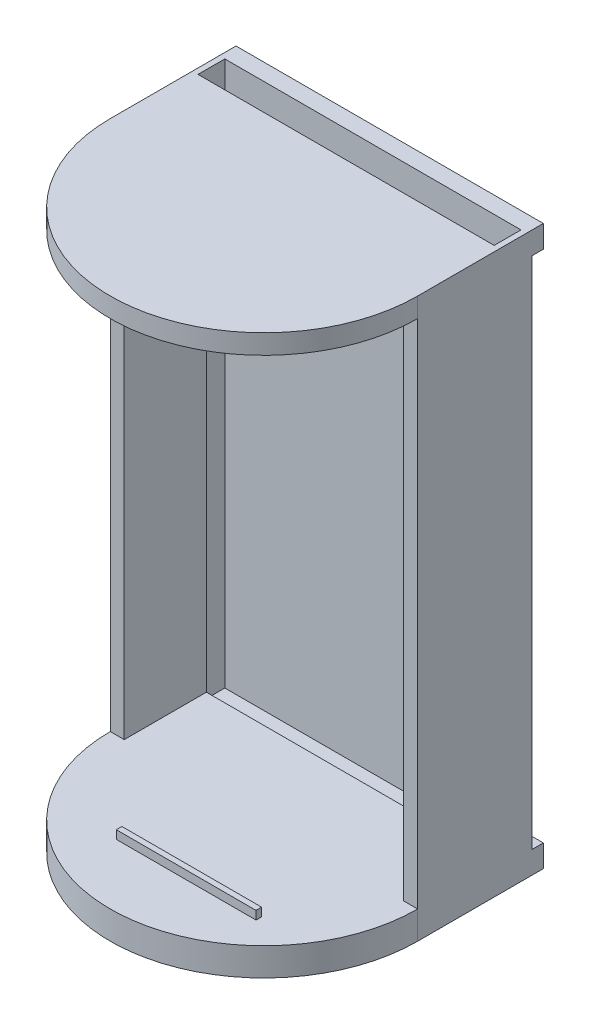
ISO-10303-21;
HEADER;
FILE_DESCRIPTION(('STEP AP214'),'2;1');
FILE_NAME('part.step','',(''),(''),'','','');
FILE_SCHEMA(('AUTOMOTIVE_DESIGN { 1 0 10303 214 1 1 1 1 }'));
ENDSEC;
DATA;
#1=APPLICATION_CONTEXT('core data for automotive mechanical design processes');
#2=APPLICATION_PROTOCOL_DEFINITION('international standard','automotive_design',2000,#1);
#3=PRODUCT_CONTEXT('',#1,'mechanical');
#4=PRODUCT('Part','Part','',(#3));
#5=PRODUCT_RELATED_PRODUCT_CATEGORY('part','',(#4));
#6=PRODUCT_DEFINITION_FORMATION('','',#4);
#7=PRODUCT_DEFINITION_CONTEXT('part definition',#1,'design');
#8=PRODUCT_DEFINITION('design','',#6,#7);
#9=PRODUCT_DEFINITION_SHAPE('','',#8);
#10=(LENGTH_UNIT() NAMED_UNIT(*) SI_UNIT(.MILLI.,.METRE.));
#11=(NAMED_UNIT(*) PLANE_ANGLE_UNIT() SI_UNIT($,.RADIAN.));
#12=(NAMED_UNIT(*) SI_UNIT($,.STERADIAN.) SOLID_ANGLE_UNIT());
#13=UNCERTAINTY_MEASURE_WITH_UNIT(LENGTH_MEASURE(1.E-05),#10,'distance_accuracy_value','');
#14=(GEOMETRIC_REPRESENTATION_CONTEXT(3) GLOBAL_UNCERTAINTY_ASSIGNED_CONTEXT((#13)) GLOBAL_UNIT_ASSIGNED_CONTEXT((#10,
#11,#12)) REPRESENTATION_CONTEXT('',''));
#15=CARTESIAN_POINT('',(0.,0.,0.));
#16=DIRECTION('',(0.,0.,1.));
#17=DIRECTION('',(1.,0.,0.));
#18=AXIS2_PLACEMENT_3D('',#15,#16,#17);
#19=CARTESIAN_POINT('',(2.69425675675678,75.5,45.));
#20=DIRECTION('',(0.,1.,0.));
#21=DIRECTION('',(0.,0.,1.));
#22=AXIS2_PLACEMENT_3D('',#19,#20,#21);
#23=PLANE('',#22);
#24=DIRECTION('',(0.,0.,-1.));
#25=VECTOR('',#24,1.);
#26=CARTESIAN_POINT('',(-47.3057432432433,75.5,45.));
#27=LINE('',#26,#25);
#28=CARTESIAN_POINT('',(-47.3057432432433,75.5,45.));
#29=VERTEX_POINT('',#28);
#30=CARTESIAN_POINT('',(-47.3057432432433,75.5,15.6));
#31=VERTEX_POINT('',#30);
#32=EDGE_CURVE('E329',#29,#31,#27,.T.);
#33=ORIENTED_EDGE('',*,*,#32,.T.);
#34=DIRECTION('',(1.,0.,0.));
#35=VECTOR('',#34,1.);
#36=CARTESIAN_POINT('',(2.69425675675677,75.5,15.6));
#37=LINE('',#36,#35);
#38=CARTESIAN_POINT('',(52.6942567567568,75.5,15.6));
#39=VERTEX_POINT('',#38);
#40=EDGE_CURVE('E251',#31,#39,#37,.T.);
#41=ORIENTED_EDGE('',*,*,#40,.T.);
#42=DIRECTION('',(0.,0.,1.));
#43=VECTOR('',#42,1.);
#44=CARTESIAN_POINT('',(52.6942567567568,75.5,45.));
#45=LINE('',#44,#43);
#46=CARTESIAN_POINT('',(52.6942567567568,75.5,45.));
#47=VERTEX_POINT('',#46);
#48=EDGE_CURVE('E325',#39,#47,#45,.T.);
#49=ORIENTED_EDGE('',*,*,#48,.T.);
#50=DIRECTION('',(-1.,0.,0.));
#51=VECTOR('',#50,1.);
#52=CARTESIAN_POINT('',(0.,75.5,45.));
#53=LINE('',#52,#51);
#54=CARTESIAN_POINT('',(57.6942567567567,75.5,45.));
#55=VERTEX_POINT('',#54);
#56=EDGE_CURVE('E362',#55,#47,#53,.T.);
#57=ORIENTED_EDGE('',*,*,#56,.F.);
#58=CARTESIAN_POINT('',(2.69425675675678,75.5,45.));
#59=DIRECTION('',(0.,1.,0.));
#60=DIRECTION('',(0.,0.,1.));
#61=AXIS2_PLACEMENT_3D('',#58,#59,#60);
#62=CIRCLE('',#61,55.);
#63=CARTESIAN_POINT('',(-52.3057432432433,75.5,45.));
#64=VERTEX_POINT('',#63);
#65=EDGE_CURVE('E317',#64,#55,#62,.T.);
#66=ORIENTED_EDGE('',*,*,#65,.F.);
#67=DIRECTION('',(-1.,0.,0.));
#68=VECTOR('',#67,1.);
#69=CARTESIAN_POINT('',(0.,75.5,45.));
#70=LINE('',#69,#68);
#71=EDGE_CURVE('E327',#29,#64,#70,.T.);
#72=ORIENTED_EDGE('',*,*,#71,.F.);
#73=EDGE_LOOP('',(#33,#41,#49,#57,#66,#72));
#74=FACE_BOUND('',#73,.T.);
#75=DIRECTION('',(0.,0.,1.));
#76=VECTOR('',#75,1.);
#77=CARTESIAN_POINT('',(29.5986502872779,75.5,77.3382333741336));
#78=LINE('',#77,#76);
#79=CARTESIAN_POINT('',(29.5986502872779,75.5,75.3382333741336));
#80=VERTEX_POINT('',#79);
#81=CARTESIAN_POINT('',(29.5986502872779,75.5,77.3382333741336));
#82=VERTEX_POINT('',#81);
#83=EDGE_CURVE('E257',#80,#82,#78,.T.);
#84=ORIENTED_EDGE('',*,*,#83,.F.);
#85=DIRECTION('',(1.,0.,0.));
#86=VECTOR('',#85,1.);
#87=CARTESIAN_POINT('',(-20.4013497127221,75.5,75.3382333741336));
#88=LINE('',#87,#86);
#89=CARTESIAN_POINT('',(-20.4013497127221,75.5,75.3382333741336));
#90=VERTEX_POINT('',#89);
#91=EDGE_CURVE('E262',#90,#80,#88,.T.);
#92=ORIENTED_EDGE('',*,*,#91,.F.);
#93=DIRECTION('',(0.,0.,-1.));
#94=VECTOR('',#93,1.);
#95=CARTESIAN_POINT('',(-20.4013497127221,75.5,77.3382333741336));
#96=LINE('',#95,#94);
#97=CARTESIAN_POINT('',(-20.4013497127221,75.5,77.3382333741336));
#98=VERTEX_POINT('',#97);
#99=EDGE_CURVE('E274',#98,#90,#96,.T.);
#100=ORIENTED_EDGE('',*,*,#99,.F.);
#101=DIRECTION('',(-1.,0.,0.));
#102=VECTOR('',#101,1.);
#103=CARTESIAN_POINT('',(-20.4013497127221,75.5,77.3382333741336));
#104=LINE('',#103,#102);
#105=EDGE_CURVE('E271',#82,#98,#104,.T.);
#106=ORIENTED_EDGE('',*,*,#105,.F.);
#107=EDGE_LOOP('',(#84,#92,#100,#106));
#108=FACE_BOUND('',#107,.T.);
#109=ADVANCED_FACE('F38',(#74,#108),#23,.F.);
#110=CARTESIAN_POINT('',(2.69425675675677,-107.5,45.));
#111=DIRECTION('',(0.,1.,0.));
#112=DIRECTION('',(0.,0.,1.));
#113=AXIS2_PLACEMENT_3D('',#110,#111,#112);
#114=PLANE('',#113);
#115=DIRECTION('',(1.,0.,0.));
#116=VECTOR('',#115,1.);
#117=CARTESIAN_POINT('',(2.69425675675677,-107.5,15.6));
#118=LINE('',#117,#116);
#119=CARTESIAN_POINT('',(-47.3057432432432,-107.5,15.6));
#120=VERTEX_POINT('',#119);
#121=CARTESIAN_POINT('',(52.6942567567568,-107.5,15.6));
#122=VERTEX_POINT('',#121);
#123=EDGE_CURVE('E53',#120,#122,#118,.T.);
#124=ORIENTED_EDGE('',*,*,#123,.F.);
#125=DIRECTION('',(0.,0.,1.));
#126=VECTOR('',#125,1.);
#127=CARTESIAN_POINT('',(-47.3057432432432,-107.5,45.));
#128=LINE('',#127,#126);
#129=CARTESIAN_POINT('',(-47.3057432432432,-107.5,45.));
#130=VERTEX_POINT('',#129);
#131=EDGE_CURVE('E373',#120,#130,#128,.T.);
#132=ORIENTED_EDGE('',*,*,#131,.T.);
#133=DIRECTION('',(1.,0.,0.));
#134=VECTOR('',#133,1.);
#135=CARTESIAN_POINT('',(2.69425675675677,-107.5,45.));
#136=LINE('',#135,#134);
#137=CARTESIAN_POINT('',(-52.3057432432432,-107.5,45.));
#138=VERTEX_POINT('',#137);
#139=EDGE_CURVE('E370',#138,#130,#136,.T.);
#140=ORIENTED_EDGE('',*,*,#139,.F.);
#141=CARTESIAN_POINT('',(2.69425675675677,-107.5,45.));
#142=DIRECTION('',(0.,-1.,0.));
#143=DIRECTION('',(0.,0.,1.));
#144=AXIS2_PLACEMENT_3D('',#141,#142,#143);
#145=CIRCLE('',#144,55.);
#146=CARTESIAN_POINT('',(57.6942567567568,-107.5,45.));
#147=VERTEX_POINT('',#146);
#148=EDGE_CURVE('E405',#147,#138,#145,.T.);
#149=ORIENTED_EDGE('',*,*,#148,.F.);
#150=DIRECTION('',(1.,0.,0.));
#151=VECTOR('',#150,1.);
#152=CARTESIAN_POINT('',(2.69425675675677,-107.5,45.));
#153=LINE('',#152,#151);
#154=CARTESIAN_POINT('',(52.6942567567568,-107.5,45.));
#155=VERTEX_POINT('',#154);
#156=EDGE_CURVE('E365',#155,#147,#153,.T.);
#157=ORIENTED_EDGE('',*,*,#156,.F.);
#158=DIRECTION('',(0.,0.,-1.));
#159=VECTOR('',#158,1.);
#160=CARTESIAN_POINT('',(52.6942567567568,-107.5,45.));
#161=LINE('',#160,#159);
#162=EDGE_CURVE('E367',#155,#122,#161,.T.);
#163=ORIENTED_EDGE('',*,*,#162,.T.);
#164=EDGE_LOOP('',(#124,#132,#140,#149,#157,#163));
#165=FACE_BOUND('',#164,.T.);
#166=DIRECTION('',(-1.,0.,0.));
#167=VECTOR('',#166,1.);
#168=CARTESIAN_POINT('',(-17.8057432432433,-107.5,75.3382333741336));
#169=LINE('',#168,#167);
#170=CARTESIAN_POINT('',(32.1942567567567,-107.5,75.3382333741336));
#171=VERTEX_POINT('',#170);
#172=CARTESIAN_POINT('',(-17.8057432432433,-107.5,75.3382333741336));
#173=VERTEX_POINT('',#172);
#174=EDGE_CURVE('E389',#171,#173,#169,.T.);
#175=ORIENTED_EDGE('',*,*,#174,.F.);
#176=DIRECTION('',(0.,0.,-1.));
#177=VECTOR('',#176,1.);
#178=CARTESIAN_POINT('',(32.1942567567567,-107.5,75.3382333741336));
#179=LINE('',#178,#177);
#180=CARTESIAN_POINT('',(32.1942567567567,-107.5,77.3382333741336));
#181=VERTEX_POINT('',#180);
#182=EDGE_CURVE('E375',#181,#171,#179,.T.);
#183=ORIENTED_EDGE('',*,*,#182,.F.);
#184=DIRECTION('',(1.,0.,0.));
#185=VECTOR('',#184,1.);
#186=CARTESIAN_POINT('',(-17.8057432432433,-107.5,77.3382333741336));
#187=LINE('',#186,#185);
#188=CARTESIAN_POINT('',(-17.8057432432433,-107.5,77.3382333741336));
#189=VERTEX_POINT('',#188);
#190=EDGE_CURVE('E380',#189,#181,#187,.T.);
#191=ORIENTED_EDGE('',*,*,#190,.F.);
#192=DIRECTION('',(0.,0.,1.));
#193=VECTOR('',#192,1.);
#194=CARTESIAN_POINT('',(-17.8057432432433,-107.5,75.3382333741336));
#195=LINE('',#194,#193);
#196=EDGE_CURVE('E391',#173,#189,#195,.T.);
#197=ORIENTED_EDGE('',*,*,#196,.F.);
#198=EDGE_LOOP('',(#175,#183,#191,#197));
#199=FACE_BOUND('',#198,.T.);
#200=ADVANCED_FACE('F457',(#165,#199),#114,.T.);
#201=CARTESIAN_POINT('',(-52.3057432432432,-107.5,15.));
#202=DIRECTION('',(-1.,0.,0.));
#203=DIRECTION('',(0.,0.,1.));
#204=AXIS2_PLACEMENT_3D('',#201,#202,#203);
#205=PLANE('',#204);
#206=DIRECTION('',(0.,0.,-1.));
#207=VECTOR('',#206,1.);
#208=CARTESIAN_POINT('',(-52.3057432432432,-117.5,15.));
#209=LINE('',#208,#207);
#210=CARTESIAN_POINT('',(-52.3057432432432,-117.5,45.));
#211=VERTEX_POINT('',#210);
#212=CARTESIAN_POINT('',(-52.3057432432433,-117.5,0.));
#213=VERTEX_POINT('',#212);
#214=EDGE_CURVE('E408',#211,#213,#209,.T.);
#215=ORIENTED_EDGE('',*,*,#214,.F.);
#216=DIRECTION('',(0.,-1.,0.));
#217=VECTOR('',#216,1.);
#218=CARTESIAN_POINT('',(-52.3057432432432,-107.5,45.));
#219=LINE('',#218,#217);
#220=EDGE_CURVE('E11',#138,#211,#219,.T.);
#221=ORIENTED_EDGE('',*,*,#220,.F.);
#222=DIRECTION('',(0.,-1.,0.));
#223=VECTOR('',#222,1.);
#224=CARTESIAN_POINT('',(-52.3057432432433,82.5,45.));
#225=LINE('',#224,#223);
#226=EDGE_CURVE('E337',#64,#138,#225,.T.);
#227=ORIENTED_EDGE('',*,*,#226,.F.);
#228=CARTESIAN_POINT('',(-52.3057432432433,82.5,45.));
#229=VERTEX_POINT('',#228);
#230=EDGE_CURVE('E338',#229,#64,#225,.T.);
#231=ORIENTED_EDGE('',*,*,#230,.F.);
#232=DIRECTION('',(0.,0.,-1.));
#233=VECTOR('',#232,1.);
#234=CARTESIAN_POINT('',(-52.3057432432433,82.5,15.));
#235=LINE('',#234,#233);
#236=CARTESIAN_POINT('',(-52.3057432432433,82.5,0.));
#237=VERTEX_POINT('',#236);
#238=EDGE_CURVE('E357',#229,#237,#235,.T.);
#239=ORIENTED_EDGE('',*,*,#238,.T.);
#240=DIRECTION('',(0.,-1.,0.));
#241=VECTOR('',#240,1.);
#242=CARTESIAN_POINT('',(-52.3057432432433,-117.5,0.));
#243=LINE('',#242,#241);
#244=CARTESIAN_POINT('',(-52.3057432432433,74.5,0.));
#245=VERTEX_POINT('',#244);
#246=EDGE_CURVE('E344',#237,#245,#243,.T.);
#247=ORIENTED_EDGE('',*,*,#246,.T.);
#248=DIRECTION('',(0.,0.,-1.));
#249=VECTOR('',#248,1.);
#250=CARTESIAN_POINT('',(-52.3057432432433,74.5,0.));
#251=LINE('',#250,#249);
#252=CARTESIAN_POINT('',(-52.3057432432433,74.5,3.99999999999998));
#253=VERTEX_POINT('',#252);
#254=EDGE_CURVE('E295',#253,#245,#251,.T.);
#255=ORIENTED_EDGE('',*,*,#254,.F.);
#256=DIRECTION('',(0.,1.,0.));
#257=VECTOR('',#256,1.);
#258=CARTESIAN_POINT('',(-52.3057432432433,74.5,3.99999999999998));
#259=LINE('',#258,#257);
#260=CARTESIAN_POINT('',(-52.3057432432433,-109.5,4.));
#261=VERTEX_POINT('',#260);
#262=EDGE_CURVE('E304',#261,#253,#259,.T.);
#263=ORIENTED_EDGE('',*,*,#262,.F.);
#264=DIRECTION('',(0.,0.,1.));
#265=VECTOR('',#264,1.);
#266=CARTESIAN_POINT('',(-52.3057432432433,-109.5,4.));
#267=LINE('',#266,#265);
#268=CARTESIAN_POINT('',(-52.3057432432433,-109.5,0.));
#269=VERTEX_POINT('',#268);
#270=EDGE_CURVE('E290',#269,#261,#267,.T.);
#271=ORIENTED_EDGE('',*,*,#270,.F.);
#272=EDGE_CURVE('E343',#269,#213,#243,.T.);
#273=ORIENTED_EDGE('',*,*,#272,.T.);
#274=EDGE_LOOP('',(#215,#221,#227,#231,#239,#247,#255,#263,#271,#273));
#275=FACE_BOUND('',#274,.T.);
#276=ADVANCED_FACE('F425',(#275),#205,.T.);
#277=CARTESIAN_POINT('',(2.69425675675677,-107.5,45.));
#278=DIRECTION('',(0.,-1.,0.));
#279=DIRECTION('',(0.,0.,-1.));
#280=AXIS2_PLACEMENT_3D('',#277,#278,#279);
#281=CYLINDRICAL_SURFACE('',#280,55.);
#282=CARTESIAN_POINT('',(2.69425675675677,-117.5,45.));
#283=DIRECTION('',(0.,-1.,0.));
#284=DIRECTION('',(0.,0.,1.));
#285=AXIS2_PLACEMENT_3D('',#282,#283,#284);
#286=CIRCLE('',#285,55.);
#287=CARTESIAN_POINT('',(57.6942567567568,-117.5,45.));
#288=VERTEX_POINT('',#287);
#289=EDGE_CURVE('E411',#288,#211,#286,.T.);
#290=ORIENTED_EDGE('',*,*,#289,.F.);
#291=DIRECTION('',(0.,-1.,0.));
#292=VECTOR('',#291,1.);
#293=CARTESIAN_POINT('',(57.6942567567568,-107.5,45.));
#294=LINE('',#293,#292);
#295=EDGE_CURVE('E42',#147,#288,#294,.T.);
#296=ORIENTED_EDGE('',*,*,#295,.F.);
#297=ORIENTED_EDGE('',*,*,#148,.T.);
#298=ORIENTED_EDGE('',*,*,#220,.T.);
#299=EDGE_LOOP('',(#290,#296,#297,#298));
#300=FACE_BOUND('',#299,.T.);
#301=ADVANCED_FACE('F436',(#300),#281,.T.);
#302=CARTESIAN_POINT('',(57.6942567567568,-107.5,45.));
#303=DIRECTION('',(1.,0.,0.));
#304=DIRECTION('',(0.,0.,-1.));
#305=AXIS2_PLACEMENT_3D('',#302,#303,#304);
#306=PLANE('',#305);
#307=DIRECTION('',(0.,1.,0.));
#308=VECTOR('',#307,1.);
#309=CARTESIAN_POINT('',(57.6942567567568,-117.5,45.));
#310=LINE('',#309,#308);
#311=EDGE_CURVE('E332',#147,#55,#310,.T.);
#312=ORIENTED_EDGE('',*,*,#311,.F.);
#313=ORIENTED_EDGE('',*,*,#295,.T.);
#314=DIRECTION('',(0.,0.,1.));
#315=VECTOR('',#314,1.);
#316=CARTESIAN_POINT('',(57.6942567567568,-117.5,45.));
#317=LINE('',#316,#315);
#318=CARTESIAN_POINT('',(57.6942567567568,-117.5,0.));
#319=VERTEX_POINT('',#318);
#320=EDGE_CURVE('E404',#319,#288,#317,.T.);
#321=ORIENTED_EDGE('',*,*,#320,.F.);
#322=DIRECTION('',(0.,1.,0.));
#323=VECTOR('',#322,1.);
#324=CARTESIAN_POINT('',(57.6942567567567,82.5,0.));
#325=LINE('',#324,#323);
#326=CARTESIAN_POINT('',(57.6942567567568,-109.5,0.));
#327=VERTEX_POINT('',#326);
#328=EDGE_CURVE('E351',#319,#327,#325,.T.);
#329=ORIENTED_EDGE('',*,*,#328,.T.);
#330=DIRECTION('',(0.,0.,1.));
#331=VECTOR('',#330,1.);
#332=CARTESIAN_POINT('',(57.6942567567568,-109.5,4.));
#333=LINE('',#332,#331);
#334=CARTESIAN_POINT('',(57.6942567567568,-109.5,4.));
#335=VERTEX_POINT('',#334);
#336=EDGE_CURVE('E291',#327,#335,#333,.T.);
#337=ORIENTED_EDGE('',*,*,#336,.T.);
#338=DIRECTION('',(0.,1.,0.));
#339=VECTOR('',#338,1.);
#340=CARTESIAN_POINT('',(57.6942567567568,74.5,3.99999999999998));
#341=LINE('',#340,#339);
#342=CARTESIAN_POINT('',(57.6942567567568,74.5,3.99999999999998));
#343=VERTEX_POINT('',#342);
#344=EDGE_CURVE('E294',#335,#343,#341,.T.);
#345=ORIENTED_EDGE('',*,*,#344,.T.);
#346=DIRECTION('',(0.,0.,-1.));
#347=VECTOR('',#346,1.);
#348=CARTESIAN_POINT('',(57.6942567567568,74.5,0.));
#349=LINE('',#348,#347);
#350=CARTESIAN_POINT('',(57.6942567567568,74.5,0.));
#351=VERTEX_POINT('',#350);
#352=EDGE_CURVE('E298',#343,#351,#349,.T.);
#353=ORIENTED_EDGE('',*,*,#352,.T.);
#354=CARTESIAN_POINT('',(57.6942567567567,82.5,0.));
#355=VERTEX_POINT('',#354);
#356=EDGE_CURVE('E350',#351,#355,#325,.T.);
#357=ORIENTED_EDGE('',*,*,#356,.T.);
#358=DIRECTION('',(0.,0.,-1.));
#359=VECTOR('',#358,1.);
#360=CARTESIAN_POINT('',(57.6942567567567,82.5,15.));
#361=LINE('',#360,#359);
#362=CARTESIAN_POINT('',(57.6942567567567,82.5,45.));
#363=VERTEX_POINT('',#362);
#364=EDGE_CURVE('E359',#363,#355,#361,.T.);
#365=ORIENTED_EDGE('',*,*,#364,.F.);
#366=DIRECTION('',(0.,1.,0.));
#367=VECTOR('',#366,1.);
#368=CARTESIAN_POINT('',(57.6942567567568,75.5,45.));
#369=LINE('',#368,#367);
#370=EDGE_CURVE('E320',#55,#363,#369,.T.);
#371=ORIENTED_EDGE('',*,*,#370,.F.);
#372=EDGE_LOOP('',(#312,#313,#321,#329,#337,#345,#353,#357,#365,#371));
#373=FACE_BOUND('',#372,.T.);
#374=ADVANCED_FACE('F40',(#373),#306,.T.);
#375=CARTESIAN_POINT('',(2.69425675675677,-117.5,45.));
#376=DIRECTION('',(0.,1.,0.));
#377=DIRECTION('',(0.,0.,1.));
#378=AXIS2_PLACEMENT_3D('',#375,#376,#377);
#379=PLANE('',#378);
#380=DIRECTION('',(1.,0.,0.));
#381=VECTOR('',#380,1.);
#382=CARTESIAN_POINT('',(57.6942567567568,-117.5,0.));
#383=LINE('',#382,#381);
#384=EDGE_CURVE('E347',#213,#319,#383,.T.);
#385=ORIENTED_EDGE('',*,*,#384,.T.);
#386=ORIENTED_EDGE('',*,*,#320,.T.);
#387=ORIENTED_EDGE('',*,*,#289,.T.);
#388=ORIENTED_EDGE('',*,*,#214,.T.);
#389=EDGE_LOOP('',(#385,#386,#387,#388));
#390=FACE_BOUND('',#389,.T.);
#391=ADVANCED_FACE('F417',(#390),#379,.F.);
#392=CARTESIAN_POINT('',(32.1942567567567,-104.5,75.3382333741336));
#393=DIRECTION('',(-1.,0.,0.));
#394=DIRECTION('',(0.,0.,1.));
#395=AXIS2_PLACEMENT_3D('',#392,#393,#394);
#396=PLANE('',#395);
#397=ORIENTED_EDGE('',*,*,#182,.T.);
#398=DIRECTION('',(0.,-1.,0.));
#399=VECTOR('',#398,1.);
#400=CARTESIAN_POINT('',(32.1942567567567,-104.5,75.3382333741336));
#401=LINE('',#400,#399);
#402=CARTESIAN_POINT('',(32.1942567567567,-104.5,75.3382333741336));
#403=VERTEX_POINT('',#402);
#404=EDGE_CURVE('E402',#403,#171,#401,.T.);
#405=ORIENTED_EDGE('',*,*,#404,.F.);
#406=DIRECTION('',(0.,0.,-1.));
#407=VECTOR('',#406,1.);
#408=CARTESIAN_POINT('',(32.1942567567567,-104.5,75.3382333741336));
#409=LINE('',#408,#407);
#410=CARTESIAN_POINT('',(32.1942567567567,-104.5,77.3382333741336));
#411=VERTEX_POINT('',#410);
#412=EDGE_CURVE('E376',#411,#403,#409,.T.);
#413=ORIENTED_EDGE('',*,*,#412,.F.);
#414=DIRECTION('',(0.,-1.,0.));
#415=VECTOR('',#414,1.);
#416=CARTESIAN_POINT('',(32.1942567567567,-104.5,77.3382333741336));
#417=LINE('',#416,#415);
#418=EDGE_CURVE('E386',#411,#181,#417,.T.);
#419=ORIENTED_EDGE('',*,*,#418,.T.);
#420=EDGE_LOOP('',(#397,#405,#413,#419));
#421=FACE_BOUND('',#420,.T.);
#422=ADVANCED_FACE('F521',(#421),#396,.F.);
#423=CARTESIAN_POINT('',(-17.8057432432433,-104.5,75.3382333741336));
#424=DIRECTION('',(0.,0.,1.));
#425=DIRECTION('',(1.,0.,0.));
#426=AXIS2_PLACEMENT_3D('',#423,#424,#425);
#427=PLANE('',#426);
#428=ORIENTED_EDGE('',*,*,#174,.T.);
#429=DIRECTION('',(0.,-1.,0.));
#430=VECTOR('',#429,1.);
#431=CARTESIAN_POINT('',(-17.8057432432433,-104.5,75.3382333741336));
#432=LINE('',#431,#430);
#433=CARTESIAN_POINT('',(-17.8057432432433,-104.5,75.3382333741336));
#434=VERTEX_POINT('',#433);
#435=EDGE_CURVE('E399',#434,#173,#432,.T.);
#436=ORIENTED_EDGE('',*,*,#435,.F.);
#437=DIRECTION('',(-1.,0.,0.));
#438=VECTOR('',#437,1.);
#439=CARTESIAN_POINT('',(-17.8057432432433,-104.5,75.3382333741336));
#440=LINE('',#439,#438);
#441=EDGE_CURVE('E379',#403,#434,#440,.T.);
#442=ORIENTED_EDGE('',*,*,#441,.F.);
#443=ORIENTED_EDGE('',*,*,#404,.T.);
#444=EDGE_LOOP('',(#428,#436,#442,#443));
#445=FACE_BOUND('',#444,.T.);
#446=ADVANCED_FACE('F517',(#445),#427,.F.);
#447=CARTESIAN_POINT('',(-17.8057432432433,-104.5,75.3382333741336));
#448=DIRECTION('',(1.,0.,0.));
#449=DIRECTION('',(0.,0.,-1.));
#450=AXIS2_PLACEMENT_3D('',#447,#448,#449);
#451=PLANE('',#450);
#452=ORIENTED_EDGE('',*,*,#196,.T.);
#453=DIRECTION('',(0.,-1.,0.));
#454=VECTOR('',#453,1.);
#455=CARTESIAN_POINT('',(-17.8057432432433,-104.5,77.3382333741336));
#456=LINE('',#455,#454);
#457=CARTESIAN_POINT('',(-17.8057432432433,-104.5,77.3382333741336));
#458=VERTEX_POINT('',#457);
#459=EDGE_CURVE('E397',#458,#189,#456,.T.);
#460=ORIENTED_EDGE('',*,*,#459,.F.);
#461=DIRECTION('',(0.,0.,1.));
#462=VECTOR('',#461,1.);
#463=CARTESIAN_POINT('',(-17.8057432432433,-104.5,75.3382333741336));
#464=LINE('',#463,#462);
#465=EDGE_CURVE('E382',#434,#458,#464,.T.);
#466=ORIENTED_EDGE('',*,*,#465,.F.);
#467=ORIENTED_EDGE('',*,*,#435,.T.);
#468=EDGE_LOOP('',(#452,#460,#466,#467));
#469=FACE_BOUND('',#468,.T.);
#470=ADVANCED_FACE('F513',(#469),#451,.F.);
#471=CARTESIAN_POINT('',(-17.8057432432433,-104.5,77.3382333741336));
#472=DIRECTION('',(0.,0.,-1.));
#473=DIRECTION('',(-1.,0.,0.));
#474=AXIS2_PLACEMENT_3D('',#471,#472,#473);
#475=PLANE('',#474);
#476=ORIENTED_EDGE('',*,*,#190,.T.);
#477=ORIENTED_EDGE('',*,*,#418,.F.);
#478=DIRECTION('',(1.,0.,0.));
#479=VECTOR('',#478,1.);
#480=CARTESIAN_POINT('',(-17.8057432432433,-104.5,77.3382333741336));
#481=LINE('',#480,#479);
#482=EDGE_CURVE('E384',#458,#411,#481,.T.);
#483=ORIENTED_EDGE('',*,*,#482,.F.);
#484=ORIENTED_EDGE('',*,*,#459,.T.);
#485=EDGE_LOOP('',(#476,#477,#483,#484));
#486=FACE_BOUND('',#485,.T.);
#487=ADVANCED_FACE('F509',(#486),#475,.F.);
#488=CARTESIAN_POINT('',(0.,-104.5,0.));
#489=DIRECTION('',(0.,1.,0.));
#490=DIRECTION('',(0.,0.,1.));
#491=AXIS2_PLACEMENT_3D('',#488,#489,#490);
#492=PLANE('',#491);
#493=ORIENTED_EDGE('',*,*,#412,.T.);
#494=ORIENTED_EDGE('',*,*,#441,.T.);
#495=ORIENTED_EDGE('',*,*,#465,.T.);
#496=ORIENTED_EDGE('',*,*,#482,.T.);
#497=EDGE_LOOP('',(#493,#494,#495,#496));
#498=FACE_BOUND('',#497,.T.);
#499=ADVANCED_FACE('F506',(#498),#492,.T.);
#500=CARTESIAN_POINT('',(0.,0.,0.));
#501=DIRECTION('',(0.,0.,-1.));
#502=DIRECTION('',(-1.,0.,0.));
#503=AXIS2_PLACEMENT_3D('',#500,#501,#502);
#504=PLANE('',#503);
#505=DIRECTION('',(-1.,0.,0.));
#506=VECTOR('',#505,1.);
#507=CARTESIAN_POINT('',(57.6942567567568,74.5,0.));
#508=LINE('',#507,#506);
#509=EDGE_CURVE('E308',#351,#245,#508,.T.);
#510=ORIENTED_EDGE('',*,*,#509,.T.);
#511=ORIENTED_EDGE('',*,*,#246,.F.);
#512=DIRECTION('',(-1.,0.,0.));
#513=VECTOR('',#512,1.);
#514=CARTESIAN_POINT('',(-52.3057432432433,82.5,0.));
#515=LINE('',#514,#513);
#516=EDGE_CURVE('E354',#355,#237,#515,.T.);
#517=ORIENTED_EDGE('',*,*,#516,.F.);
#518=ORIENTED_EDGE('',*,*,#356,.F.);
#519=EDGE_LOOP('',(#510,#511,#517,#518));
#520=FACE_BOUND('',#519,.T.);
#521=ADVANCED_FACE('F500',(#520),#504,.T.);
#522=CARTESIAN_POINT('',(-47.3057432432432,-117.5,45.));
#523=DIRECTION('',(-1.,0.,0.));
#524=DIRECTION('',(0.,-1.,0.));
#525=AXIS2_PLACEMENT_3D('',#522,#523,#524);
#526=PLANE('',#525);
#527=ORIENTED_EDGE('',*,*,#131,.F.);
#528=DIRECTION('',(0.,1.,0.));
#529=VECTOR('',#528,1.);
#530=CARTESIAN_POINT('',(-47.3057432432432,-117.5,15.6));
#531=LINE('',#530,#529);
#532=EDGE_CURVE('E254',#120,#31,#531,.T.);
#533=ORIENTED_EDGE('',*,*,#532,.T.);
#534=ORIENTED_EDGE('',*,*,#32,.F.);
#535=DIRECTION('',(0.,1.,0.));
#536=VECTOR('',#535,1.);
#537=CARTESIAN_POINT('',(-47.3057432432432,-117.5,45.));
#538=LINE('',#537,#536);
#539=EDGE_CURVE('E341',#130,#29,#538,.T.);
#540=ORIENTED_EDGE('',*,*,#539,.F.);
#541=EDGE_LOOP('',(#527,#533,#534,#540));
#542=FACE_BOUND('',#541,.T.);
#543=ADVANCED_FACE('F464',(#542),#526,.F.);
#544=CARTESIAN_POINT('',(0.,0.,45.));
#545=DIRECTION('',(0.,0.,1.));
#546=DIRECTION('',(1.,0.,0.));
#547=AXIS2_PLACEMENT_3D('',#544,#545,#546);
#548=PLANE('',#547);
#549=ORIENTED_EDGE('',*,*,#226,.T.);
#550=ORIENTED_EDGE('',*,*,#139,.T.);
#551=ORIENTED_EDGE('',*,*,#539,.T.);
#552=ORIENTED_EDGE('',*,*,#71,.T.);
#553=EDGE_LOOP('',(#549,#550,#551,#552));
#554=FACE_BOUND('',#553,.T.);
#555=ADVANCED_FACE('F461',(#554),#548,.T.);
#556=CARTESIAN_POINT('',(52.6942567567568,82.5,45.));
#557=DIRECTION('',(1.,0.,0.));
#558=DIRECTION('',(0.,1.,0.));
#559=AXIS2_PLACEMENT_3D('',#556,#557,#558);
#560=PLANE('',#559);
#561=ORIENTED_EDGE('',*,*,#48,.F.);
#562=DIRECTION('',(0.,-1.,0.));
#563=VECTOR('',#562,1.);
#564=CARTESIAN_POINT('',(52.6942567567568,82.5,15.6));
#565=LINE('',#564,#563);
#566=EDGE_CURVE('E245',#39,#122,#565,.T.);
#567=ORIENTED_EDGE('',*,*,#566,.T.);
#568=ORIENTED_EDGE('',*,*,#162,.F.);
#569=DIRECTION('',(0.,-1.,0.));
#570=VECTOR('',#569,1.);
#571=CARTESIAN_POINT('',(52.6942567567568,82.5,45.));
#572=LINE('',#571,#570);
#573=EDGE_CURVE('E334',#47,#155,#572,.T.);
#574=ORIENTED_EDGE('',*,*,#573,.F.);
#575=EDGE_LOOP('',(#561,#567,#568,#574));
#576=FACE_BOUND('',#575,.T.);
#577=ADVANCED_FACE('F455',(#576),#560,.F.);
#578=CARTESIAN_POINT('',(0.,0.,45.));
#579=DIRECTION('',(0.,0.,1.));
#580=DIRECTION('',(1.,0.,0.));
#581=AXIS2_PLACEMENT_3D('',#578,#579,#580);
#582=PLANE('',#581);
#583=ORIENTED_EDGE('',*,*,#573,.T.);
#584=ORIENTED_EDGE('',*,*,#156,.T.);
#585=ORIENTED_EDGE('',*,*,#311,.T.);
#586=ORIENTED_EDGE('',*,*,#56,.T.);
#587=EDGE_LOOP('',(#583,#584,#585,#586));
#588=FACE_BOUND('',#587,.T.);
#589=ADVANCED_FACE('F452',(#588),#582,.T.);
#590=CARTESIAN_POINT('',(-52.3057432432433,82.5,15.));
#591=DIRECTION('',(0.,-1.,0.));
#592=DIRECTION('',(1.,0.,0.));
#593=AXIS2_PLACEMENT_3D('',#590,#591,#592);
#594=PLANE('',#593);
#595=DIRECTION('',(1.,0.,0.));
#596=VECTOR('',#595,1.);
#597=CARTESIAN_POINT('',(55.6942567567567,82.5,15.6));
#598=LINE('',#597,#596);
#599=CARTESIAN_POINT('',(-50.3057432432433,82.5,15.6));
#600=VERTEX_POINT('',#599);
#601=CARTESIAN_POINT('',(55.6942567567567,82.5,15.6));
#602=VERTEX_POINT('',#601);
#603=EDGE_CURVE('E239',#600,#602,#598,.T.);
#604=ORIENTED_EDGE('',*,*,#603,.F.);
#605=DIRECTION('',(0.,0.,1.));
#606=VECTOR('',#605,1.);
#607=CARTESIAN_POINT('',(-50.3057432432433,82.5,15.6));
#608=LINE('',#607,#606);
#609=CARTESIAN_POINT('',(-50.3057432432433,82.5,6.00000000000001));
#610=VERTEX_POINT('',#609);
#611=EDGE_CURVE('E61',#610,#600,#608,.T.);
#612=ORIENTED_EDGE('',*,*,#611,.F.);
#613=DIRECTION('',(-1.,0.,0.));
#614=VECTOR('',#613,1.);
#615=CARTESIAN_POINT('',(55.6942567567567,82.5,6.));
#616=LINE('',#615,#614);
#617=CARTESIAN_POINT('',(55.6942567567567,82.5,6.));
#618=VERTEX_POINT('',#617);
#619=EDGE_CURVE('E230',#618,#610,#616,.T.);
#620=ORIENTED_EDGE('',*,*,#619,.F.);
#621=DIRECTION('',(0.,0.,-1.));
#622=VECTOR('',#621,1.);
#623=CARTESIAN_POINT('',(55.6942567567567,82.5,15.6));
#624=LINE('',#623,#622);
#625=EDGE_CURVE('E233',#602,#618,#624,.T.);
#626=ORIENTED_EDGE('',*,*,#625,.F.);
#627=EDGE_LOOP('',(#604,#612,#620,#626));
#628=FACE_BOUND('',#627,.T.);
#629=ORIENTED_EDGE('',*,*,#516,.T.);
#630=ORIENTED_EDGE('',*,*,#238,.F.);
#631=CARTESIAN_POINT('',(2.69425675675678,82.5,45.));
#632=DIRECTION('',(0.,1.,0.));
#633=DIRECTION('',(0.,0.,1.));
#634=AXIS2_PLACEMENT_3D('',#631,#632,#633);
#635=CIRCLE('',#634,55.);
#636=EDGE_CURVE('E311',#229,#363,#635,.T.);
#637=ORIENTED_EDGE('',*,*,#636,.T.);
#638=ORIENTED_EDGE('',*,*,#364,.T.);
#639=EDGE_LOOP('',(#629,#630,#637,#638));
#640=FACE_BOUND('',#639,.T.);
#641=ADVANCED_FACE('F493',(#628,#640),#594,.F.);
#642=DIRECTION('',(-1.,0.,0.));
#643=VECTOR('',#642,1.);
#644=CARTESIAN_POINT('',(57.6942567567568,-109.5,0.));
#645=LINE('',#644,#643);
#646=EDGE_CURVE('E301',#327,#269,#645,.T.);
#647=ORIENTED_EDGE('',*,*,#646,.F.);
#648=ORIENTED_EDGE('',*,*,#328,.F.);
#649=ORIENTED_EDGE('',*,*,#384,.F.);
#650=ORIENTED_EDGE('',*,*,#272,.F.);
#651=EDGE_LOOP('',(#647,#648,#649,#650));
#652=FACE_BOUND('',#651,.T.);
#653=ADVANCED_FACE('F429',(#652),#504,.T.);
#654=CARTESIAN_POINT('',(2.69425675675678,75.5,45.));
#655=DIRECTION('',(0.,1.,0.));
#656=DIRECTION('',(0.,0.,1.));
#657=AXIS2_PLACEMENT_3D('',#654,#655,#656);
#658=CYLINDRICAL_SURFACE('',#657,55.);
#659=ORIENTED_EDGE('',*,*,#636,.F.);
#660=ORIENTED_EDGE('',*,*,#230,.T.);
#661=ORIENTED_EDGE('',*,*,#65,.T.);
#662=ORIENTED_EDGE('',*,*,#370,.T.);
#663=EDGE_LOOP('',(#659,#660,#661,#662));
#664=FACE_BOUND('',#663,.T.);
#665=ADVANCED_FACE('F444',(#664),#658,.T.);
#666=CARTESIAN_POINT('',(57.6942567567568,74.5,0.));
#667=DIRECTION('',(0.,1.,0.));
#668=DIRECTION('',(0.,0.,1.));
#669=AXIS2_PLACEMENT_3D('',#666,#667,#668);
#670=PLANE('',#669);
#671=ORIENTED_EDGE('',*,*,#254,.T.);
#672=ORIENTED_EDGE('',*,*,#509,.F.);
#673=ORIENTED_EDGE('',*,*,#352,.F.);
#674=DIRECTION('',(-1.,0.,0.));
#675=VECTOR('',#674,1.);
#676=CARTESIAN_POINT('',(57.6942567567568,74.5,3.99999999999998));
#677=LINE('',#676,#675);
#678=EDGE_CURVE('E312',#343,#253,#677,.T.);
#679=ORIENTED_EDGE('',*,*,#678,.T.);
#680=EDGE_LOOP('',(#671,#672,#673,#679));
#681=FACE_BOUND('',#680,.T.);
#682=ADVANCED_FACE('F490',(#681),#670,.F.);
#683=CARTESIAN_POINT('',(57.6942567567568,74.5,3.99999999999998));
#684=DIRECTION('',(0.,0.,1.));
#685=DIRECTION('',(0.,-1.,0.));
#686=AXIS2_PLACEMENT_3D('',#683,#684,#685);
#687=PLANE('',#686);
#688=ORIENTED_EDGE('',*,*,#262,.T.);
#689=ORIENTED_EDGE('',*,*,#678,.F.);
#690=ORIENTED_EDGE('',*,*,#344,.F.);
#691=DIRECTION('',(-1.,0.,0.));
#692=VECTOR('',#691,1.);
#693=CARTESIAN_POINT('',(57.6942567567568,-109.5,4.));
#694=LINE('',#693,#692);
#695=EDGE_CURVE('E314',#335,#261,#694,.T.);
#696=ORIENTED_EDGE('',*,*,#695,.T.);
#697=EDGE_LOOP('',(#688,#689,#690,#696));
#698=FACE_BOUND('',#697,.T.);
#699=ADVANCED_FACE('F600',(#698),#687,.F.);
#700=CARTESIAN_POINT('',(57.6942567567568,-109.5,4.));
#701=DIRECTION('',(0.,-1.,0.));
#702=DIRECTION('',(0.,0.,-1.));
#703=AXIS2_PLACEMENT_3D('',#700,#701,#702);
#704=PLANE('',#703);
#705=ORIENTED_EDGE('',*,*,#270,.T.);
#706=ORIENTED_EDGE('',*,*,#695,.F.);
#707=ORIENTED_EDGE('',*,*,#336,.F.);
#708=ORIENTED_EDGE('',*,*,#646,.T.);
#709=EDGE_LOOP('',(#705,#706,#707,#708));
#710=FACE_BOUND('',#709,.T.);
#711=ADVANCED_FACE('F486',(#710),#704,.F.);
#712=CARTESIAN_POINT('',(29.5986502872779,72.5,77.3382333741336));
#713=DIRECTION('',(-1.,0.,0.));
#714=DIRECTION('',(0.,0.,1.));
#715=AXIS2_PLACEMENT_3D('',#712,#713,#714);
#716=PLANE('',#715);
#717=ORIENTED_EDGE('',*,*,#83,.T.);
#718=DIRECTION('',(0.,1.,0.));
#719=VECTOR('',#718,1.);
#720=CARTESIAN_POINT('',(29.5986502872779,72.5,77.3382333741336));
#721=LINE('',#720,#719);
#722=CARTESIAN_POINT('',(29.5986502872779,72.5,77.3382333741336));
#723=VERTEX_POINT('',#722);
#724=EDGE_CURVE('E287',#723,#82,#721,.T.);
#725=ORIENTED_EDGE('',*,*,#724,.F.);
#726=DIRECTION('',(0.,0.,1.));
#727=VECTOR('',#726,1.);
#728=CARTESIAN_POINT('',(29.5986502872779,72.5,77.3382333741336));
#729=LINE('',#728,#727);
#730=CARTESIAN_POINT('',(29.5986502872779,72.5,75.3382333741336));
#731=VERTEX_POINT('',#730);
#732=EDGE_CURVE('E258',#731,#723,#729,.T.);
#733=ORIENTED_EDGE('',*,*,#732,.F.);
#734=DIRECTION('',(0.,1.,0.));
#735=VECTOR('',#734,1.);
#736=CARTESIAN_POINT('',(29.5986502872779,72.5,75.3382333741336));
#737=LINE('',#736,#735);
#738=EDGE_CURVE('E268',#731,#80,#737,.T.);
#739=ORIENTED_EDGE('',*,*,#738,.T.);
#740=EDGE_LOOP('',(#717,#725,#733,#739));
#741=FACE_BOUND('',#740,.T.);
#742=ADVANCED_FACE('F614',(#741),#716,.F.);
#743=CARTESIAN_POINT('',(-20.4013497127221,72.5,77.3382333741336));
#744=DIRECTION('',(0.,0.,-1.));
#745=DIRECTION('',(-1.,0.,0.));
#746=AXIS2_PLACEMENT_3D('',#743,#744,#745);
#747=PLANE('',#746);
#748=ORIENTED_EDGE('',*,*,#105,.T.);
#749=DIRECTION('',(0.,1.,0.));
#750=VECTOR('',#749,1.);
#751=CARTESIAN_POINT('',(-20.4013497127221,72.5,77.3382333741336));
#752=LINE('',#751,#750);
#753=CARTESIAN_POINT('',(-20.4013497127221,72.5,77.3382333741336));
#754=VERTEX_POINT('',#753);
#755=EDGE_CURVE('E284',#754,#98,#752,.T.);
#756=ORIENTED_EDGE('',*,*,#755,.F.);
#757=DIRECTION('',(-1.,0.,0.));
#758=VECTOR('',#757,1.);
#759=CARTESIAN_POINT('',(-20.4013497127221,72.5,77.3382333741336));
#760=LINE('',#759,#758);
#761=EDGE_CURVE('E261',#723,#754,#760,.T.);
#762=ORIENTED_EDGE('',*,*,#761,.F.);
#763=ORIENTED_EDGE('',*,*,#724,.T.);
#764=EDGE_LOOP('',(#748,#756,#762,#763));
#765=FACE_BOUND('',#764,.T.);
#766=ADVANCED_FACE('F621',(#765),#747,.F.);
#767=CARTESIAN_POINT('',(-20.4013497127221,72.5,77.3382333741336));
#768=DIRECTION('',(1.,0.,0.));
#769=DIRECTION('',(0.,0.,-1.));
#770=AXIS2_PLACEMENT_3D('',#767,#768,#769);
#771=PLANE('',#770);
#772=ORIENTED_EDGE('',*,*,#99,.T.);
#773=DIRECTION('',(0.,1.,0.));
#774=VECTOR('',#773,1.);
#775=CARTESIAN_POINT('',(-20.4013497127221,72.5,75.3382333741336));
#776=LINE('',#775,#774);
#777=CARTESIAN_POINT('',(-20.4013497127221,72.5,75.3382333741336));
#778=VERTEX_POINT('',#777);
#779=EDGE_CURVE('E281',#778,#90,#776,.T.);
#780=ORIENTED_EDGE('',*,*,#779,.F.);
#781=DIRECTION('',(0.,0.,-1.));
#782=VECTOR('',#781,1.);
#783=CARTESIAN_POINT('',(-20.4013497127221,72.5,77.3382333741336));
#784=LINE('',#783,#782);
#785=EDGE_CURVE('E264',#754,#778,#784,.T.);
#786=ORIENTED_EDGE('',*,*,#785,.F.);
#787=ORIENTED_EDGE('',*,*,#755,.T.);
#788=EDGE_LOOP('',(#772,#780,#786,#787));
#789=FACE_BOUND('',#788,.T.);
#790=ADVANCED_FACE('F629',(#789),#771,.F.);
#791=CARTESIAN_POINT('',(-20.4013497127221,72.5,75.3382333741336));
#792=DIRECTION('',(0.,0.,1.));
#793=DIRECTION('',(1.,0.,0.));
#794=AXIS2_PLACEMENT_3D('',#791,#792,#793);
#795=PLANE('',#794);
#796=ORIENTED_EDGE('',*,*,#91,.T.);
#797=ORIENTED_EDGE('',*,*,#738,.F.);
#798=DIRECTION('',(1.,0.,0.));
#799=VECTOR('',#798,1.);
#800=CARTESIAN_POINT('',(-20.4013497127221,72.5,75.3382333741336));
#801=LINE('',#800,#799);
#802=EDGE_CURVE('E266',#778,#731,#801,.T.);
#803=ORIENTED_EDGE('',*,*,#802,.F.);
#804=ORIENTED_EDGE('',*,*,#779,.T.);
#805=EDGE_LOOP('',(#796,#797,#803,#804));
#806=FACE_BOUND('',#805,.T.);
#807=ADVANCED_FACE('F474',(#806),#795,.F.);
#808=CARTESIAN_POINT('',(0.,72.5,0.));
#809=DIRECTION('',(0.,-1.,0.));
#810=DIRECTION('',(0.,0.,-1.));
#811=AXIS2_PLACEMENT_3D('',#808,#809,#810);
#812=PLANE('',#811);
#813=ORIENTED_EDGE('',*,*,#732,.T.);
#814=ORIENTED_EDGE('',*,*,#761,.T.);
#815=ORIENTED_EDGE('',*,*,#785,.T.);
#816=ORIENTED_EDGE('',*,*,#802,.T.);
#817=EDGE_LOOP('',(#813,#814,#815,#816));
#818=FACE_BOUND('',#817,.T.);
#819=ADVANCED_FACE('F466',(#818),#812,.T.);
#820=CARTESIAN_POINT('',(55.6942567567568,-112.5,15.6));
#821=DIRECTION('',(0.,0.,1.));
#822=DIRECTION('',(1.,0.,0.));
#823=AXIS2_PLACEMENT_3D('',#820,#821,#822);
#824=PLANE('',#823);
#825=ORIENTED_EDGE('',*,*,#603,.T.);
#826=DIRECTION('',(0.,1.,0.));
#827=VECTOR('',#826,1.);
#828=CARTESIAN_POINT('',(55.6942567567568,-112.5,15.6));
#829=LINE('',#828,#827);
#830=CARTESIAN_POINT('',(55.6942567567568,-112.5,15.6));
#831=VERTEX_POINT('',#830);
#832=EDGE_CURVE('E217',#831,#602,#829,.T.);
#833=ORIENTED_EDGE('',*,*,#832,.F.);
#834=DIRECTION('',(1.,0.,0.));
#835=VECTOR('',#834,1.);
#836=CARTESIAN_POINT('',(55.6942567567568,-112.5,15.6));
#837=LINE('',#836,#835);
#838=CARTESIAN_POINT('',(-50.3057432432432,-112.5,15.6));
#839=VERTEX_POINT('',#838);
#840=EDGE_CURVE('E221',#839,#831,#837,.T.);
#841=ORIENTED_EDGE('',*,*,#840,.F.);
#842=DIRECTION('',(0.,1.,0.));
#843=VECTOR('',#842,1.);
#844=CARTESIAN_POINT('',(-50.3057432432432,-112.5,15.6));
#845=LINE('',#844,#843);
#846=EDGE_CURVE('E208',#839,#600,#845,.T.);
#847=ORIENTED_EDGE('',*,*,#846,.T.);
#848=EDGE_LOOP('',(#825,#833,#841,#847));
#849=FACE_BOUND('',#848,.T.);
#850=ORIENTED_EDGE('',*,*,#123,.T.);
#851=ORIENTED_EDGE('',*,*,#566,.F.);
#852=ORIENTED_EDGE('',*,*,#40,.F.);
#853=ORIENTED_EDGE('',*,*,#532,.F.);
#854=EDGE_LOOP('',(#850,#851,#852,#853));
#855=FACE_BOUND('',#854,.T.);
#856=ADVANCED_FACE('F222',(#849,#855),#824,.F.);
#857=CARTESIAN_POINT('',(-50.3057432432432,-112.5,15.6));
#858=DIRECTION('',(-1.,0.,0.));
#859=DIRECTION('',(0.,-1.,0.));
#860=AXIS2_PLACEMENT_3D('',#857,#858,#859);
#861=PLANE('',#860);
#862=ORIENTED_EDGE('',*,*,#611,.T.);
#863=ORIENTED_EDGE('',*,*,#846,.F.);
#864=DIRECTION('',(0.,0.,1.));
#865=VECTOR('',#864,1.);
#866=CARTESIAN_POINT('',(-50.3057432432432,-112.5,15.6));
#867=LINE('',#866,#865);
#868=CARTESIAN_POINT('',(-50.3057432432432,-112.5,6.00000000000001));
#869=VERTEX_POINT('',#868);
#870=EDGE_CURVE('E212',#869,#839,#867,.T.);
#871=ORIENTED_EDGE('',*,*,#870,.F.);
#872=DIRECTION('',(0.,1.,0.));
#873=VECTOR('',#872,1.);
#874=CARTESIAN_POINT('',(-50.3057432432432,-112.5,6.00000000000001));
#875=LINE('',#874,#873);
#876=EDGE_CURVE('E243',#869,#610,#875,.T.);
#877=ORIENTED_EDGE('',*,*,#876,.T.);
#878=EDGE_LOOP('',(#862,#863,#871,#877));
#879=FACE_BOUND('',#878,.T.);
#880=ADVANCED_FACE('F210',(#879),#861,.F.);
#881=CARTESIAN_POINT('',(55.6942567567568,-112.5,6.));
#882=DIRECTION('',(0.,0.,-1.));
#883=DIRECTION('',(-1.,0.,0.));
#884=AXIS2_PLACEMENT_3D('',#881,#882,#883);
#885=PLANE('',#884);
#886=ORIENTED_EDGE('',*,*,#619,.T.);
#887=ORIENTED_EDGE('',*,*,#876,.F.);
#888=DIRECTION('',(-1.,0.,0.));
#889=VECTOR('',#888,1.);
#890=CARTESIAN_POINT('',(55.6942567567568,-112.5,6.));
#891=LINE('',#890,#889);
#892=CARTESIAN_POINT('',(55.6942567567568,-112.5,6.));
#893=VERTEX_POINT('',#892);
#894=EDGE_CURVE('E218',#893,#869,#891,.T.);
#895=ORIENTED_EDGE('',*,*,#894,.F.);
#896=DIRECTION('',(0.,1.,0.));
#897=VECTOR('',#896,1.);
#898=CARTESIAN_POINT('',(55.6942567567568,-112.5,6.));
#899=LINE('',#898,#897);
#900=EDGE_CURVE('E246',#893,#618,#899,.T.);
#901=ORIENTED_EDGE('',*,*,#900,.T.);
#902=EDGE_LOOP('',(#886,#887,#895,#901));
#903=FACE_BOUND('',#902,.T.);
#904=ADVANCED_FACE('F472',(#903),#885,.F.);
#905=CARTESIAN_POINT('',(55.6942567567568,-112.5,15.6));
#906=DIRECTION('',(1.,0.,0.));
#907=DIRECTION('',(0.,1.,0.));
#908=AXIS2_PLACEMENT_3D('',#905,#906,#907);
#909=PLANE('',#908);
#910=ORIENTED_EDGE('',*,*,#625,.T.);
#911=ORIENTED_EDGE('',*,*,#900,.F.);
#912=DIRECTION('',(0.,0.,-1.));
#913=VECTOR('',#912,1.);
#914=CARTESIAN_POINT('',(55.6942567567568,-112.5,15.6));
#915=LINE('',#914,#913);
#916=EDGE_CURVE('E226',#831,#893,#915,.T.);
#917=ORIENTED_EDGE('',*,*,#916,.F.);
#918=ORIENTED_EDGE('',*,*,#832,.T.);
#919=EDGE_LOOP('',(#910,#911,#917,#918));
#920=FACE_BOUND('',#919,.T.);
#921=ADVANCED_FACE('F761',(#920),#909,.F.);
#922=CARTESIAN_POINT('',(0.,-112.5,0.));
#923=DIRECTION('',(0.,1.,0.));
#924=DIRECTION('',(-1.,0.,0.));
#925=AXIS2_PLACEMENT_3D('',#922,#923,#924);
#926=PLANE('',#925);
#927=ORIENTED_EDGE('',*,*,#870,.T.);
#928=ORIENTED_EDGE('',*,*,#840,.T.);
#929=ORIENTED_EDGE('',*,*,#916,.T.);
#930=ORIENTED_EDGE('',*,*,#894,.T.);
#931=EDGE_LOOP('',(#927,#928,#929,#930));
#932=FACE_BOUND('',#931,.T.);
#933=ADVANCED_FACE('F228',(#932),#926,.T.);
#934=CLOSED_SHELL('',(#109,#200,#276,#301,#374,#391,#422,#446,#470,#487,#499,#521,#543,#555,
#577,#589,#641,#653,#665,#682,#699,#711,#742,#766,#790,#807,#819,#856,#880,#904,#921,#933));
#935=MANIFOLD_SOLID_BREP('B2',#934);
#936=ADVANCED_BREP_SHAPE_REPRESENTATION('',(#18,#935),#14);
#937=SHAPE_DEFINITION_REPRESENTATION(#9,#936);
ENDSEC;
END-ISO-10303-21;
